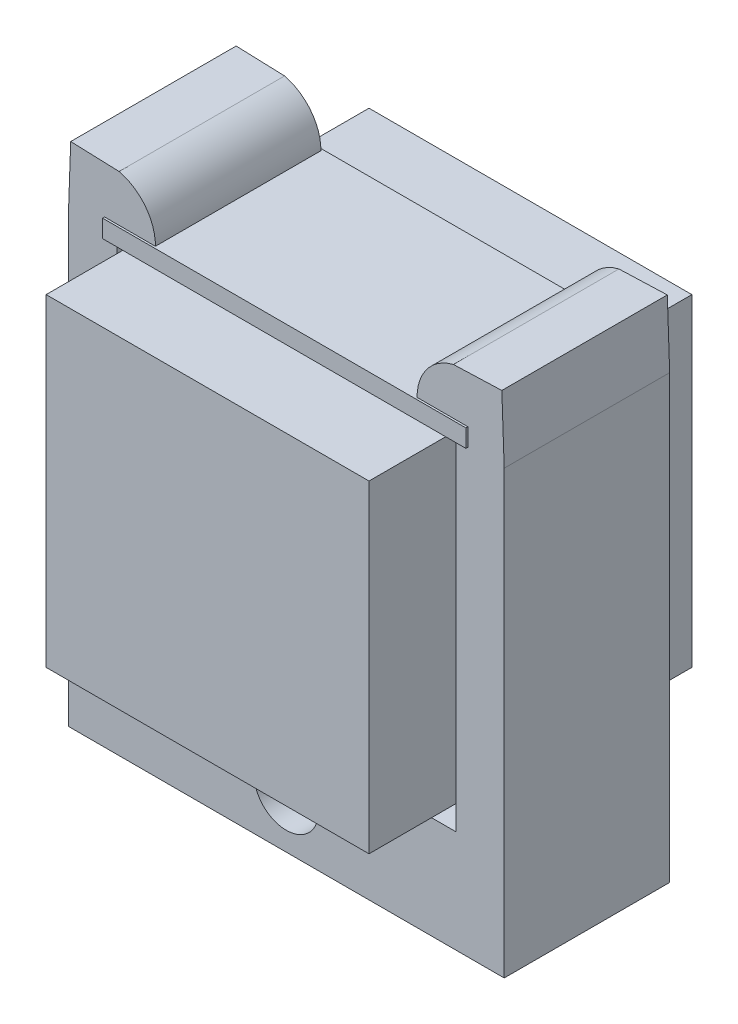
ISO-10303-21;
HEADER;
FILE_DESCRIPTION(('STEP AP214'),'2;1');
FILE_NAME('part.step','',(''),(''),'','','');
FILE_SCHEMA(('AUTOMOTIVE_DESIGN { 1 0 10303 214 1 1 1 1 }'));
ENDSEC;
DATA;
#1=APPLICATION_CONTEXT('core data for automotive mechanical design processes');
#2=APPLICATION_PROTOCOL_DEFINITION('international standard','automotive_design',2000,#1);
#3=PRODUCT_CONTEXT('',#1,'mechanical');
#4=PRODUCT('Part','Part','',(#3));
#5=PRODUCT_RELATED_PRODUCT_CATEGORY('part','',(#4));
#6=PRODUCT_DEFINITION_FORMATION('','',#4);
#7=PRODUCT_DEFINITION_CONTEXT('part definition',#1,'design');
#8=PRODUCT_DEFINITION('design','',#6,#7);
#9=PRODUCT_DEFINITION_SHAPE('','',#8);
#10=(LENGTH_UNIT() NAMED_UNIT(*) SI_UNIT(.MILLI.,.METRE.));
#11=(NAMED_UNIT(*) PLANE_ANGLE_UNIT() SI_UNIT($,.RADIAN.));
#12=(NAMED_UNIT(*) SI_UNIT($,.STERADIAN.) SOLID_ANGLE_UNIT());
#13=UNCERTAINTY_MEASURE_WITH_UNIT(LENGTH_MEASURE(1.E-05),#10,'distance_accuracy_value','');
#14=(GEOMETRIC_REPRESENTATION_CONTEXT(3) GLOBAL_UNCERTAINTY_ASSIGNED_CONTEXT((#13)) GLOBAL_UNIT_ASSIGNED_CONTEXT((#10,
#11,#12)) REPRESENTATION_CONTEXT('',''));
#15=CARTESIAN_POINT('',(0.,0.,0.));
#16=DIRECTION('',(0.,0.,1.));
#17=DIRECTION('',(1.,0.,0.));
#18=AXIS2_PLACEMENT_3D('',#15,#16,#17);
#19=CARTESIAN_POINT('',(-22.1162360565613,2.24126818755349,10.25));
#20=DIRECTION('',(0.,0.,-1.));
#21=DIRECTION('',(-1.,0.,0.));
#22=AXIS2_PLACEMENT_3D('',#19,#20,#21);
#23=CYLINDRICAL_SURFACE('',#22,5.90884853000027);
#24=CARTESIAN_POINT('',(-22.1162360565613,2.24126818755349,-10.25));
#25=DIRECTION('',(0.,0.,1.));
#26=DIRECTION('',(1.,0.,0.));
#27=AXIS2_PLACEMENT_3D('',#24,#25,#26);
#28=CIRCLE('',#27,5.90884853000027);
#29=CARTESIAN_POINT('',(-20.7111523237129,7.98062622257545,-10.25));
#30=VERTEX_POINT('',#29);
#31=CARTESIAN_POINT('',(-16.2111523237129,2.03037233995178,-10.25));
#32=VERTEX_POINT('',#31);
#33=EDGE_CURVE('E199',#30,#32,#28,.F.);
#34=ORIENTED_EDGE('',*,*,#33,.F.);
#35=DIRECTION('',(0.,0.,-1.));
#36=VECTOR('',#35,1.);
#37=CARTESIAN_POINT('',(-20.7111523237129,7.98062622257545,10.25));
#38=LINE('',#37,#36);
#39=CARTESIAN_POINT('',(-20.7111523237129,7.98062622257545,10.25));
#40=VERTEX_POINT('',#39);
#41=EDGE_CURVE('E12',#40,#30,#38,.T.);
#42=ORIENTED_EDGE('',*,*,#41,.F.);
#43=CARTESIAN_POINT('',(-22.1162360565613,2.24126818755349,10.25));
#44=DIRECTION('',(0.,0.,1.));
#45=DIRECTION('',(1.,0.,0.));
#46=AXIS2_PLACEMENT_3D('',#43,#44,#45);
#47=CIRCLE('',#46,5.90884853000027);
#48=CARTESIAN_POINT('',(-16.2111523237129,2.03037233995178,10.25));
#49=VERTEX_POINT('',#48);
#50=EDGE_CURVE('E242',#40,#49,#47,.F.);
#51=ORIENTED_EDGE('',*,*,#50,.T.);
#52=DIRECTION('',(0.,0.,-1.));
#53=VECTOR('',#52,1.);
#54=CARTESIAN_POINT('',(-16.2111523237129,2.03037233995178,10.25));
#55=LINE('',#54,#53);
#56=EDGE_CURVE('E70',#49,#32,#55,.T.);
#57=ORIENTED_EDGE('',*,*,#56,.T.);
#58=EDGE_LOOP('',(#34,#42,#51,#57));
#59=FACE_BOUND('',#58,.T.);
#60=ADVANCED_FACE('F54',(#59),#23,.T.);
#61=CARTESIAN_POINT('',(0.258275645743161,7.23171808080924,10.25));
#62=DIRECTION('',(0.0356915305124089,0.99936285434755,0.));
#63=DIRECTION('',(-0.99936285434755,0.0356915305124089,0.));
#64=AXIS2_PLACEMENT_3D('',#61,#62,#63);
#65=PLANE('',#64);
#66=DIRECTION('',(0.99936285434755,-0.0356915305124089,0.));
#67=VECTOR('',#66,1.);
#68=CARTESIAN_POINT('',(0.258275645743161,7.23171808080924,-10.25));
#69=LINE('',#68,#67);
#70=CARTESIAN_POINT('',(-26.7073294497982,8.19477540564991,-10.25));
#71=VERTEX_POINT('',#70);
#72=EDGE_CURVE('E201',#71,#30,#69,.T.);
#73=ORIENTED_EDGE('',*,*,#72,.F.);
#74=DIRECTION('',(0.,0.,-1.));
#75=VECTOR('',#74,1.);
#76=CARTESIAN_POINT('',(-26.7073294497982,8.19477540564991,10.25));
#77=LINE('',#76,#75);
#78=CARTESIAN_POINT('',(-26.7073294497982,8.19477540564991,10.25));
#79=VERTEX_POINT('',#78);
#80=EDGE_CURVE('E62',#79,#71,#77,.T.);
#81=ORIENTED_EDGE('',*,*,#80,.F.);
#82=DIRECTION('',(0.99936285434755,-0.0356915305124089,0.));
#83=VECTOR('',#82,1.);
#84=CARTESIAN_POINT('',(0.258275645743161,7.23171808080924,10.25));
#85=LINE('',#84,#83);
#86=EDGE_CURVE('E293',#79,#40,#85,.T.);
#87=ORIENTED_EDGE('',*,*,#86,.T.);
#88=ORIENTED_EDGE('',*,*,#41,.T.);
#89=EDGE_LOOP('',(#73,#81,#87,#88));
#90=FACE_BOUND('',#89,.T.);
#91=ADVANCED_FACE('F279',(#90),#65,.T.);
#92=CARTESIAN_POINT('',(-26.9656050955414,0.963057324840671,10.25));
#93=DIRECTION('',(-0.99936285434755,0.035691530512409,0.));
#94=DIRECTION('',(-0.035691530512409,-0.99936285434755,0.));
#95=AXIS2_PLACEMENT_3D('',#92,#93,#94);
#96=PLANE('',#95);
#97=DIRECTION('',(0.035691530512409,0.99936285434755,0.));
#98=VECTOR('',#97,1.);
#99=CARTESIAN_POINT('',(-26.9656050955414,0.963057324840671,-10.25));
#100=LINE('',#99,#98);
#101=CARTESIAN_POINT('',(-27.,0.,-10.25));
#102=VERTEX_POINT('',#101);
#103=EDGE_CURVE('E204',#102,#71,#100,.T.);
#104=ORIENTED_EDGE('',*,*,#103,.F.);
#105=DIRECTION('',(0.,0.,-1.));
#106=VECTOR('',#105,1.);
#107=CARTESIAN_POINT('',(-27.,0.,10.25));
#108=LINE('',#107,#106);
#109=CARTESIAN_POINT('',(-27.,0.,10.25));
#110=VERTEX_POINT('',#109);
#111=EDGE_CURVE('E268',#110,#102,#108,.T.);
#112=ORIENTED_EDGE('',*,*,#111,.F.);
#113=DIRECTION('',(0.035691530512409,0.99936285434755,0.));
#114=VECTOR('',#113,1.);
#115=CARTESIAN_POINT('',(-26.9656050955414,0.963057324840671,10.25));
#116=LINE('',#115,#114);
#117=EDGE_CURVE('E275',#110,#79,#116,.T.);
#118=ORIENTED_EDGE('',*,*,#117,.T.);
#119=ORIENTED_EDGE('',*,*,#80,.T.);
#120=EDGE_LOOP('',(#104,#112,#118,#119));
#121=FACE_BOUND('',#120,.T.);
#122=ADVANCED_FACE('F273',(#121),#96,.T.);
#123=CARTESIAN_POINT('',(-27.,0.,10.25));
#124=DIRECTION('',(-1.,0.,0.));
#125=DIRECTION('',(0.,0.,1.));
#126=AXIS2_PLACEMENT_3D('',#123,#124,#125);
#127=PLANE('',#126);
#128=DIRECTION('',(0.,1.,0.));
#129=VECTOR('',#128,1.);
#130=CARTESIAN_POINT('',(-27.,0.,-10.25));
#131=LINE('',#130,#129);
#132=CARTESIAN_POINT('',(-27.,-54.7,-10.25));
#133=VERTEX_POINT('',#132);
#134=EDGE_CURVE('E207',#133,#102,#131,.T.);
#135=ORIENTED_EDGE('',*,*,#134,.F.);
#136=DIRECTION('',(0.,0.,-1.));
#137=VECTOR('',#136,1.);
#138=CARTESIAN_POINT('',(-27.,-54.7,10.25));
#139=LINE('',#138,#137);
#140=CARTESIAN_POINT('',(-27.,-54.7,10.25));
#141=VERTEX_POINT('',#140);
#142=EDGE_CURVE('E266',#141,#133,#139,.T.);
#143=ORIENTED_EDGE('',*,*,#142,.F.);
#144=DIRECTION('',(0.,1.,0.));
#145=VECTOR('',#144,1.);
#146=CARTESIAN_POINT('',(-27.,0.,10.25));
#147=LINE('',#146,#145);
#148=EDGE_CURVE('E290',#141,#110,#147,.T.);
#149=ORIENTED_EDGE('',*,*,#148,.T.);
#150=ORIENTED_EDGE('',*,*,#111,.T.);
#151=EDGE_LOOP('',(#135,#143,#149,#150));
#152=FACE_BOUND('',#151,.T.);
#153=ADVANCED_FACE('F287',(#152),#127,.T.);
#154=CARTESIAN_POINT('',(0.,-54.7,10.25));
#155=DIRECTION('',(0.,-1.,0.));
#156=DIRECTION('',(0.,0.,-1.));
#157=AXIS2_PLACEMENT_3D('',#154,#155,#156);
#158=PLANE('',#157);
#159=DIRECTION('',(-1.,0.,0.));
#160=VECTOR('',#159,1.);
#161=CARTESIAN_POINT('',(0.,-54.7,-10.25));
#162=LINE('',#161,#160);
#163=CARTESIAN_POINT('',(27.,-54.7,-10.25));
#164=VERTEX_POINT('',#163);
#165=EDGE_CURVE('E210',#164,#133,#162,.T.);
#166=ORIENTED_EDGE('',*,*,#165,.F.);
#167=DIRECTION('',(0.,0.,-1.));
#168=VECTOR('',#167,1.);
#169=CARTESIAN_POINT('',(27.,-54.7,10.25));
#170=LINE('',#169,#168);
#171=CARTESIAN_POINT('',(27.,-54.7,10.25));
#172=VERTEX_POINT('',#171);
#173=EDGE_CURVE('E264',#172,#164,#170,.T.);
#174=ORIENTED_EDGE('',*,*,#173,.F.);
#175=DIRECTION('',(-1.,0.,0.));
#176=VECTOR('',#175,1.);
#177=CARTESIAN_POINT('',(0.,-54.7,10.25));
#178=LINE('',#177,#176);
#179=EDGE_CURVE('E295',#172,#141,#178,.T.);
#180=ORIENTED_EDGE('',*,*,#179,.T.);
#181=ORIENTED_EDGE('',*,*,#142,.T.);
#182=EDGE_LOOP('',(#166,#174,#180,#181));
#183=FACE_BOUND('',#182,.T.);
#184=ADVANCED_FACE('F342',(#183),#158,.T.);
#185=CARTESIAN_POINT('',(27.,0.,10.25));
#186=DIRECTION('',(-1.,0.,0.));
#187=DIRECTION('',(0.,0.,1.));
#188=AXIS2_PLACEMENT_3D('',#185,#186,#187);
#189=PLANE('',#188);
#190=DIRECTION('',(0.,1.,0.));
#191=VECTOR('',#190,1.);
#192=CARTESIAN_POINT('',(27.,0.,-10.25));
#193=LINE('',#192,#191);
#194=CARTESIAN_POINT('',(27.,0.,-10.25));
#195=VERTEX_POINT('',#194);
#196=EDGE_CURVE('E213',#164,#195,#193,.T.);
#197=ORIENTED_EDGE('',*,*,#196,.T.);
#198=DIRECTION('',(0.,0.,-1.));
#199=VECTOR('',#198,1.);
#200=CARTESIAN_POINT('',(27.,0.,10.25));
#201=LINE('',#200,#199);
#202=CARTESIAN_POINT('',(27.,0.,10.25));
#203=VERTEX_POINT('',#202);
#204=EDGE_CURVE('E261',#203,#195,#201,.T.);
#205=ORIENTED_EDGE('',*,*,#204,.F.);
#206=DIRECTION('',(0.,1.,0.));
#207=VECTOR('',#206,1.);
#208=CARTESIAN_POINT('',(27.,0.,10.25));
#209=LINE('',#208,#207);
#210=EDGE_CURVE('E301',#172,#203,#209,.T.);
#211=ORIENTED_EDGE('',*,*,#210,.F.);
#212=ORIENTED_EDGE('',*,*,#173,.T.);
#213=EDGE_LOOP('',(#197,#205,#211,#212));
#214=FACE_BOUND('',#213,.T.);
#215=ADVANCED_FACE('F345',(#214),#189,.F.);
#216=CARTESIAN_POINT('',(26.9656050955414,0.963057324840671,10.25));
#217=DIRECTION('',(-0.99936285434755,-0.035691530512409,0.));
#218=DIRECTION('',(0.035691530512409,-0.99936285434755,0.));
#219=AXIS2_PLACEMENT_3D('',#216,#217,#218);
#220=PLANE('',#219);
#221=DIRECTION('',(-0.035691530512409,0.99936285434755,0.));
#222=VECTOR('',#221,1.);
#223=CARTESIAN_POINT('',(26.9656050955414,0.963057324840671,-10.25));
#224=LINE('',#223,#222);
#225=CARTESIAN_POINT('',(26.7073294497982,8.19477540564991,-10.25));
#226=VERTEX_POINT('',#225);
#227=EDGE_CURVE('E215',#195,#226,#224,.T.);
#228=ORIENTED_EDGE('',*,*,#227,.T.);
#229=DIRECTION('',(0.,0.,-1.));
#230=VECTOR('',#229,1.);
#231=CARTESIAN_POINT('',(26.7073294497982,8.19477540564991,10.25));
#232=LINE('',#231,#230);
#233=CARTESIAN_POINT('',(26.7073294497982,8.19477540564991,10.25));
#234=VERTEX_POINT('',#233);
#235=EDGE_CURVE('E258',#234,#226,#232,.T.);
#236=ORIENTED_EDGE('',*,*,#235,.F.);
#237=DIRECTION('',(-0.035691530512409,0.99936285434755,0.));
#238=VECTOR('',#237,1.);
#239=CARTESIAN_POINT('',(26.9656050955414,0.963057324840671,10.25));
#240=LINE('',#239,#238);
#241=EDGE_CURVE('E303',#203,#234,#240,.T.);
#242=ORIENTED_EDGE('',*,*,#241,.F.);
#243=ORIENTED_EDGE('',*,*,#204,.T.);
#244=EDGE_LOOP('',(#228,#236,#242,#243));
#245=FACE_BOUND('',#244,.T.);
#246=ADVANCED_FACE('F349',(#245),#220,.F.);
#247=CARTESIAN_POINT('',(-0.258275645743161,7.23171808080924,10.25));
#248=DIRECTION('',(0.0356915305124089,-0.99936285434755,0.));
#249=DIRECTION('',(0.99936285434755,0.0356915305124089,0.));
#250=AXIS2_PLACEMENT_3D('',#247,#248,#249);
#251=PLANE('',#250);
#252=DIRECTION('',(-0.99936285434755,-0.0356915305124089,0.));
#253=VECTOR('',#252,1.);
#254=CARTESIAN_POINT('',(-0.258275645743161,7.23171808080924,-10.25));
#255=LINE('',#254,#253);
#256=CARTESIAN_POINT('',(20.7111523237129,7.98062622257545,-10.25));
#257=VERTEX_POINT('',#256);
#258=EDGE_CURVE('E217',#226,#257,#255,.T.);
#259=ORIENTED_EDGE('',*,*,#258,.T.);
#260=DIRECTION('',(0.,0.,-1.));
#261=VECTOR('',#260,1.);
#262=CARTESIAN_POINT('',(20.7111523237129,7.98062622257545,10.25));
#263=LINE('',#262,#261);
#264=CARTESIAN_POINT('',(20.7111523237129,7.98062622257545,10.25));
#265=VERTEX_POINT('',#264);
#266=EDGE_CURVE('E255',#265,#257,#263,.T.);
#267=ORIENTED_EDGE('',*,*,#266,.F.);
#268=DIRECTION('',(-0.99936285434755,-0.0356915305124089,0.));
#269=VECTOR('',#268,1.);
#270=CARTESIAN_POINT('',(-0.258275645743161,7.23171808080924,10.25));
#271=LINE('',#270,#269);
#272=EDGE_CURVE('E305',#234,#265,#271,.T.);
#273=ORIENTED_EDGE('',*,*,#272,.F.);
#274=ORIENTED_EDGE('',*,*,#235,.T.);
#275=EDGE_LOOP('',(#259,#267,#273,#274));
#276=FACE_BOUND('',#275,.T.);
#277=ADVANCED_FACE('F353',(#276),#251,.F.);
#278=CARTESIAN_POINT('',(22.1162360565613,2.24126818755349,10.25));
#279=DIRECTION('',(0.,0.,-1.));
#280=DIRECTION('',(-1.,0.,0.));
#281=AXIS2_PLACEMENT_3D('',#278,#279,#280);
#282=CYLINDRICAL_SURFACE('',#281,5.90884853000027);
#283=CARTESIAN_POINT('',(22.1162360565613,2.24126818755349,-10.25));
#284=DIRECTION('',(0.,0.,1.));
#285=DIRECTION('',(1.,0.,0.));
#286=AXIS2_PLACEMENT_3D('',#283,#284,#285);
#287=CIRCLE('',#286,5.90884853000027);
#288=CARTESIAN_POINT('',(16.2111523237129,2.03037233995178,-10.25));
#289=VERTEX_POINT('',#288);
#290=EDGE_CURVE('E219',#257,#289,#287,.T.);
#291=ORIENTED_EDGE('',*,*,#290,.T.);
#292=DIRECTION('',(0.,0.,-1.));
#293=VECTOR('',#292,1.);
#294=CARTESIAN_POINT('',(16.2111523237129,2.03037233995178,10.25));
#295=LINE('',#294,#293);
#296=CARTESIAN_POINT('',(16.2111523237129,2.03037233995178,10.25));
#297=VERTEX_POINT('',#296);
#298=EDGE_CURVE('E252',#297,#289,#295,.T.);
#299=ORIENTED_EDGE('',*,*,#298,.F.);
#300=CARTESIAN_POINT('',(22.1162360565613,2.24126818755349,10.25));
#301=DIRECTION('',(0.,0.,1.));
#302=DIRECTION('',(1.,0.,0.));
#303=AXIS2_PLACEMENT_3D('',#300,#301,#302);
#304=CIRCLE('',#303,5.90884853000027);
#305=EDGE_CURVE('E307',#265,#297,#304,.T.);
#306=ORIENTED_EDGE('',*,*,#305,.F.);
#307=ORIENTED_EDGE('',*,*,#266,.T.);
#308=EDGE_LOOP('',(#291,#299,#306,#307));
#309=FACE_BOUND('',#308,.T.);
#310=ADVANCED_FACE('F357',(#309),#282,.T.);
#311=CARTESIAN_POINT('',(-0.0517697747706173,1.44955369357742,10.25));
#312=DIRECTION('',(-0.0356915305124093,0.99936285434755,0.));
#313=DIRECTION('',(-0.99936285434755,-0.0356915305124093,0.));
#314=AXIS2_PLACEMENT_3D('',#311,#312,#313);
#315=PLANE('',#314);
#316=DIRECTION('',(0.99936285434755,0.0356915305124093,0.));
#317=VECTOR('',#316,1.);
#318=CARTESIAN_POINT('',(-0.0517697747706173,1.44955369357742,-10.25));
#319=LINE('',#318,#317);
#320=CARTESIAN_POINT('',(20.9214786328727,2.19859827956461,-10.25));
#321=VERTEX_POINT('',#320);
#322=EDGE_CURVE('E221',#289,#321,#319,.T.);
#323=ORIENTED_EDGE('',*,*,#322,.T.);
#324=DIRECTION('',(0.,0.,-1.));
#325=VECTOR('',#324,1.);
#326=CARTESIAN_POINT('',(20.9214786328727,2.19859827956461,10.25));
#327=LINE('',#326,#325);
#328=CARTESIAN_POINT('',(20.9214786328727,2.19859827956461,10.25));
#329=VERTEX_POINT('',#328);
#330=EDGE_CURVE('E250',#329,#321,#327,.T.);
#331=ORIENTED_EDGE('',*,*,#330,.F.);
#332=DIRECTION('',(0.99936285434755,0.0356915305124093,0.));
#333=VECTOR('',#332,1.);
#334=CARTESIAN_POINT('',(-0.0517697747706173,1.44955369357742,10.25));
#335=LINE('',#334,#333);
#336=EDGE_CURVE('E309',#297,#329,#335,.T.);
#337=ORIENTED_EDGE('',*,*,#336,.F.);
#338=ORIENTED_EDGE('',*,*,#298,.T.);
#339=EDGE_LOOP('',(#323,#331,#337,#338));
#340=FACE_BOUND('',#339,.T.);
#341=ADVANCED_FACE('F361',(#340),#315,.F.);
#342=CARTESIAN_POINT('',(20.9732484076433,0.749044585987179,10.25));
#343=DIRECTION('',(-0.99936285434755,-0.0356915305124086,0.));
#344=DIRECTION('',(0.0356915305124086,-0.99936285434755,0.));
#345=AXIS2_PLACEMENT_3D('',#342,#343,#344);
#346=PLANE('',#345);
#347=DIRECTION('',(-0.0356915305124086,0.99936285434755,0.));
#348=VECTOR('',#347,1.);
#349=CARTESIAN_POINT('',(20.9732484076433,0.749044585987179,-10.25));
#350=LINE('',#349,#348);
#351=CARTESIAN_POINT('',(21.,0.,-10.25));
#352=VERTEX_POINT('',#351);
#353=EDGE_CURVE('E224',#352,#321,#350,.T.);
#354=ORIENTED_EDGE('',*,*,#353,.F.);
#355=DIRECTION('',(0.,0.,-1.));
#356=VECTOR('',#355,1.);
#357=CARTESIAN_POINT('',(21.,0.,10.25));
#358=LINE('',#357,#356);
#359=CARTESIAN_POINT('',(21.,0.,10.25));
#360=VERTEX_POINT('',#359);
#361=EDGE_CURVE('E248',#360,#352,#358,.T.);
#362=ORIENTED_EDGE('',*,*,#361,.F.);
#363=DIRECTION('',(-0.0356915305124086,0.99936285434755,0.));
#364=VECTOR('',#363,1.);
#365=CARTESIAN_POINT('',(20.9732484076433,0.749044585987179,10.25));
#366=LINE('',#365,#364);
#367=EDGE_CURVE('E311',#360,#329,#366,.T.);
#368=ORIENTED_EDGE('',*,*,#367,.T.);
#369=ORIENTED_EDGE('',*,*,#330,.T.);
#370=EDGE_LOOP('',(#354,#362,#368,#369));
#371=FACE_BOUND('',#370,.T.);
#372=ADVANCED_FACE('F365',(#371),#346,.T.);
#373=CARTESIAN_POINT('',(21.,0.,10.25));
#374=DIRECTION('',(-1.,0.,0.));
#375=DIRECTION('',(0.,0.,1.));
#376=AXIS2_PLACEMENT_3D('',#373,#374,#375);
#377=PLANE('',#376);
#378=DIRECTION('',(0.,1.,0.));
#379=VECTOR('',#378,1.);
#380=CARTESIAN_POINT('',(21.,0.,-10.25));
#381=LINE('',#380,#379);
#382=CARTESIAN_POINT('',(21.,-42.,-10.25));
#383=VERTEX_POINT('',#382);
#384=EDGE_CURVE('E227',#383,#352,#381,.T.);
#385=ORIENTED_EDGE('',*,*,#384,.F.);
#386=DIRECTION('',(0.,0.,-1.));
#387=VECTOR('',#386,1.);
#388=CARTESIAN_POINT('',(21.,-42.,10.25));
#389=LINE('',#388,#387);
#390=CARTESIAN_POINT('',(21.,-42.,10.25));
#391=VERTEX_POINT('',#390);
#392=EDGE_CURVE('E246',#391,#383,#389,.T.);
#393=ORIENTED_EDGE('',*,*,#392,.F.);
#394=DIRECTION('',(0.,1.,0.));
#395=VECTOR('',#394,1.);
#396=CARTESIAN_POINT('',(21.,0.,10.25));
#397=LINE('',#396,#395);
#398=EDGE_CURVE('E314',#391,#360,#397,.T.);
#399=ORIENTED_EDGE('',*,*,#398,.T.);
#400=ORIENTED_EDGE('',*,*,#361,.T.);
#401=EDGE_LOOP('',(#385,#393,#399,#400));
#402=FACE_BOUND('',#401,.T.);
#403=ADVANCED_FACE('F369',(#402),#377,.T.);
#404=CARTESIAN_POINT('',(0.,-42.,10.25));
#405=DIRECTION('',(0.,1.,0.));
#406=DIRECTION('',(0.,0.,1.));
#407=AXIS2_PLACEMENT_3D('',#404,#405,#406);
#408=PLANE('',#407);
#409=DIRECTION('',(1.,0.,0.));
#410=VECTOR('',#409,1.);
#411=CARTESIAN_POINT('',(0.,-42.,-10.25));
#412=LINE('',#411,#410);
#413=CARTESIAN_POINT('',(-21.,-42.,-10.25));
#414=VERTEX_POINT('',#413);
#415=EDGE_CURVE('E230',#414,#383,#412,.T.);
#416=ORIENTED_EDGE('',*,*,#415,.F.);
#417=DIRECTION('',(0.,0.,-1.));
#418=VECTOR('',#417,1.);
#419=CARTESIAN_POINT('',(-21.,-42.,10.25));
#420=LINE('',#419,#418);
#421=CARTESIAN_POINT('',(-21.,-42.,10.25));
#422=VERTEX_POINT('',#421);
#423=EDGE_CURVE('E188',#422,#414,#420,.T.);
#424=ORIENTED_EDGE('',*,*,#423,.F.);
#425=DIRECTION('',(1.,0.,0.));
#426=VECTOR('',#425,1.);
#427=CARTESIAN_POINT('',(0.,-42.,10.25));
#428=LINE('',#427,#426);
#429=EDGE_CURVE('E178',#422,#391,#428,.T.);
#430=ORIENTED_EDGE('',*,*,#429,.T.);
#431=ORIENTED_EDGE('',*,*,#392,.T.);
#432=EDGE_LOOP('',(#416,#424,#430,#431));
#433=FACE_BOUND('',#432,.T.);
#434=ADVANCED_FACE('F318',(#433),#408,.T.);
#435=CARTESIAN_POINT('',(-21.,0.,10.25));
#436=DIRECTION('',(-1.,0.,0.));
#437=DIRECTION('',(0.,0.,1.));
#438=AXIS2_PLACEMENT_3D('',#435,#436,#437);
#439=PLANE('',#438);
#440=DIRECTION('',(0.,1.,0.));
#441=VECTOR('',#440,1.);
#442=CARTESIAN_POINT('',(-21.,0.,-10.25));
#443=LINE('',#442,#441);
#444=CARTESIAN_POINT('',(-21.,0.,-10.25));
#445=VERTEX_POINT('',#444);
#446=EDGE_CURVE('E185',#414,#445,#443,.T.);
#447=ORIENTED_EDGE('',*,*,#446,.T.);
#448=DIRECTION('',(0.,0.,-1.));
#449=VECTOR('',#448,1.);
#450=CARTESIAN_POINT('',(-21.,0.,10.25));
#451=LINE('',#450,#449);
#452=CARTESIAN_POINT('',(-21.,0.,10.25));
#453=VERTEX_POINT('',#452);
#454=EDGE_CURVE('E182',#453,#445,#451,.T.);
#455=ORIENTED_EDGE('',*,*,#454,.F.);
#456=DIRECTION('',(0.,1.,0.));
#457=VECTOR('',#456,1.);
#458=CARTESIAN_POINT('',(-21.,0.,10.25));
#459=LINE('',#458,#457);
#460=EDGE_CURVE('E169',#422,#453,#459,.T.);
#461=ORIENTED_EDGE('',*,*,#460,.F.);
#462=ORIENTED_EDGE('',*,*,#423,.T.);
#463=EDGE_LOOP('',(#447,#455,#461,#462));
#464=FACE_BOUND('',#463,.T.);
#465=ADVANCED_FACE('F183',(#464),#439,.F.);
#466=CARTESIAN_POINT('',(-20.9732484076433,0.749044585987146,10.25));
#467=DIRECTION('',(-0.99936285434755,0.035691530512407,0.));
#468=DIRECTION('',(-0.035691530512407,-0.99936285434755,0.));
#469=AXIS2_PLACEMENT_3D('',#466,#467,#468);
#470=PLANE('',#469);
#471=DIRECTION('',(0.035691530512407,0.99936285434755,0.));
#472=VECTOR('',#471,1.);
#473=CARTESIAN_POINT('',(-20.9732484076433,0.749044585987146,-10.25));
#474=LINE('',#473,#472);
#475=CARTESIAN_POINT('',(-20.9214786328727,2.19859827956461,-10.25));
#476=VERTEX_POINT('',#475);
#477=EDGE_CURVE('E234',#445,#476,#474,.T.);
#478=ORIENTED_EDGE('',*,*,#477,.T.);
#479=DIRECTION('',(0.,0.,-1.));
#480=VECTOR('',#479,1.);
#481=CARTESIAN_POINT('',(-20.9214786328727,2.19859827956461,10.25));
#482=LINE('',#481,#480);
#483=CARTESIAN_POINT('',(-20.9214786328727,2.19859827956461,10.25));
#484=VERTEX_POINT('',#483);
#485=EDGE_CURVE('E120',#484,#476,#482,.T.);
#486=ORIENTED_EDGE('',*,*,#485,.F.);
#487=DIRECTION('',(0.035691530512407,0.99936285434755,0.));
#488=VECTOR('',#487,1.);
#489=CARTESIAN_POINT('',(-20.9732484076433,0.749044585987146,10.25));
#490=LINE('',#489,#488);
#491=EDGE_CURVE('E175',#453,#484,#490,.T.);
#492=ORIENTED_EDGE('',*,*,#491,.F.);
#493=ORIENTED_EDGE('',*,*,#454,.T.);
#494=EDGE_LOOP('',(#478,#486,#492,#493));
#495=FACE_BOUND('',#494,.T.);
#496=ADVANCED_FACE('F190',(#495),#470,.F.);
#497=CARTESIAN_POINT('',(0.0517697747706173,1.44955369357742,10.25));
#498=DIRECTION('',(-0.0356915305124092,-0.99936285434755,0.));
#499=DIRECTION('',(0.99936285434755,-0.0356915305124092,0.));
#500=AXIS2_PLACEMENT_3D('',#497,#498,#499);
#501=PLANE('',#500);
#502=DIRECTION('',(-0.99936285434755,0.0356915305124092,0.));
#503=VECTOR('',#502,1.);
#504=CARTESIAN_POINT('',(0.0517697747706173,1.44955369357742,-10.25));
#505=LINE('',#504,#503);
#506=EDGE_CURVE('E236',#32,#476,#505,.T.);
#507=ORIENTED_EDGE('',*,*,#506,.F.);
#508=ORIENTED_EDGE('',*,*,#56,.F.);
#509=DIRECTION('',(-0.99936285434755,0.0356915305124092,0.));
#510=VECTOR('',#509,1.);
#511=CARTESIAN_POINT('',(0.0517697747706173,1.44955369357742,10.25));
#512=LINE('',#511,#510);
#513=EDGE_CURVE('E191',#49,#484,#512,.T.);
#514=ORIENTED_EDGE('',*,*,#513,.T.);
#515=ORIENTED_EDGE('',*,*,#485,.T.);
#516=EDGE_LOOP('',(#507,#508,#514,#515));
#517=FACE_BOUND('',#516,.T.);
#518=ADVANCED_FACE('F320',(#517),#501,.T.);
#519=CARTESIAN_POINT('',(0.,-48.35,10.25));
#520=DIRECTION('',(0.,0.,-1.));
#521=DIRECTION('',(-1.,0.,0.));
#522=AXIS2_PLACEMENT_3D('',#519,#520,#521);
#523=CYLINDRICAL_SURFACE('',#522,4.);
#524=CARTESIAN_POINT('',(0.,-48.35,10.25));
#525=DIRECTION('',(0.,0.,1.));
#526=DIRECTION('',(1.,0.,0.));
#527=AXIS2_PLACEMENT_3D('',#524,#525,#526);
#528=CIRCLE('',#527,4.);
#529=CARTESIAN_POINT('',(4.,-48.35,10.25));
#530=VERTEX_POINT('',#529);
#531=EDGE_CURVE('E193',#530,#530,#528,.T.);
#532=ORIENTED_EDGE('',*,*,#531,.T.);
#533=EDGE_LOOP('',(#532));
#534=FACE_BOUND('',#533,.T.);
#535=CARTESIAN_POINT('',(0.,-48.35,-10.25));
#536=DIRECTION('',(0.,0.,1.));
#537=DIRECTION('',(1.,0.,0.));
#538=AXIS2_PLACEMENT_3D('',#535,#536,#537);
#539=CIRCLE('',#538,4.);
#540=CARTESIAN_POINT('',(4.,-48.35,-10.25));
#541=VERTEX_POINT('',#540);
#542=EDGE_CURVE('E239',#541,#541,#539,.T.);
#543=ORIENTED_EDGE('',*,*,#542,.F.);
#544=EDGE_LOOP('',(#543));
#545=FACE_BOUND('',#544,.T.);
#546=ADVANCED_FACE('F322',(#534,#545),#523,.F.);
#547=CARTESIAN_POINT('',(0.,0.,10.25));
#548=DIRECTION('',(0.,0.,1.));
#549=DIRECTION('',(1.,0.,0.));
#550=AXIS2_PLACEMENT_3D('',#547,#548,#549);
#551=PLANE('',#550);
#552=ORIENTED_EDGE('',*,*,#50,.F.);
#553=ORIENTED_EDGE('',*,*,#86,.F.);
#554=ORIENTED_EDGE('',*,*,#117,.F.);
#555=ORIENTED_EDGE('',*,*,#148,.F.);
#556=ORIENTED_EDGE('',*,*,#179,.F.);
#557=ORIENTED_EDGE('',*,*,#210,.T.);
#558=ORIENTED_EDGE('',*,*,#241,.T.);
#559=ORIENTED_EDGE('',*,*,#272,.T.);
#560=ORIENTED_EDGE('',*,*,#305,.T.);
#561=ORIENTED_EDGE('',*,*,#336,.T.);
#562=ORIENTED_EDGE('',*,*,#367,.F.);
#563=ORIENTED_EDGE('',*,*,#398,.F.);
#564=ORIENTED_EDGE('',*,*,#429,.F.);
#565=ORIENTED_EDGE('',*,*,#460,.T.);
#566=ORIENTED_EDGE('',*,*,#491,.T.);
#567=ORIENTED_EDGE('',*,*,#513,.F.);
#568=EDGE_LOOP('',(#552,#553,#554,#555,#556,#557,#558,#559,#560,#561,#562,#563,#564,#565,#566,#567));
#569=FACE_BOUND('',#568,.T.);
#570=ORIENTED_EDGE('',*,*,#531,.F.);
#571=EDGE_LOOP('',(#570));
#572=FACE_BOUND('',#571,.T.);
#573=ADVANCED_FACE('F171',(#569,#572),#551,.T.);
#574=CARTESIAN_POINT('',(0.,0.,-10.25));
#575=DIRECTION('',(0.,0.,1.));
#576=DIRECTION('',(1.,0.,0.));
#577=AXIS2_PLACEMENT_3D('',#574,#575,#576);
#578=PLANE('',#577);
#579=ORIENTED_EDGE('',*,*,#33,.T.);
#580=ORIENTED_EDGE('',*,*,#506,.T.);
#581=ORIENTED_EDGE('',*,*,#477,.F.);
#582=ORIENTED_EDGE('',*,*,#446,.F.);
#583=ORIENTED_EDGE('',*,*,#415,.T.);
#584=ORIENTED_EDGE('',*,*,#384,.T.);
#585=ORIENTED_EDGE('',*,*,#353,.T.);
#586=ORIENTED_EDGE('',*,*,#322,.F.);
#587=ORIENTED_EDGE('',*,*,#290,.F.);
#588=ORIENTED_EDGE('',*,*,#258,.F.);
#589=ORIENTED_EDGE('',*,*,#227,.F.);
#590=ORIENTED_EDGE('',*,*,#196,.F.);
#591=ORIENTED_EDGE('',*,*,#165,.T.);
#592=ORIENTED_EDGE('',*,*,#134,.T.);
#593=ORIENTED_EDGE('',*,*,#103,.T.);
#594=ORIENTED_EDGE('',*,*,#72,.T.);
#595=EDGE_LOOP('',(#579,#580,#581,#582,#583,#584,#585,#586,#587,#588,#589,#590,#591,#592,#593,#594));
#596=FACE_BOUND('',#595,.T.);
#597=ORIENTED_EDGE('',*,*,#542,.T.);
#598=EDGE_LOOP('',(#597));
#599=FACE_BOUND('',#598,.T.);
#600=ADVANCED_FACE('F281',(#596,#599),#578,.F.);
#601=CLOSED_SHELL('',(#60,#91,#122,#153,#184,#215,#246,#277,#310,#341,#372,#403,#434,#465,#496,
#518,#546,#573,#600));
#602=MANIFOLD_SOLID_BREP('B2',#601);
#603=CARTESIAN_POINT('',(20.,-40.,20.));
#604=DIRECTION('',(1.,0.,0.));
#605=DIRECTION('',(0.,0.,-1.));
#606=AXIS2_PLACEMENT_3D('',#603,#604,#605);
#607=PLANE('',#606);
#608=DIRECTION('',(0.,0.,-1.));
#609=VECTOR('',#608,1.);
#610=CARTESIAN_POINT('',(20.,0.,20.));
#611=LINE('',#610,#609);
#612=CARTESIAN_POINT('',(20.,0.,20.));
#613=VERTEX_POINT('',#612);
#614=CARTESIAN_POINT('',(20.,0.,-20.));
#615=VERTEX_POINT('',#614);
#616=EDGE_CURVE('E646',#613,#615,#611,.T.);
#617=ORIENTED_EDGE('',*,*,#616,.F.);
#618=DIRECTION('',(0.,1.,0.));
#619=VECTOR('',#618,1.);
#620=CARTESIAN_POINT('',(20.,-40.,20.));
#621=LINE('',#620,#619);
#622=CARTESIAN_POINT('',(20.,-40.,20.));
#623=VERTEX_POINT('',#622);
#624=EDGE_CURVE('E52',#623,#613,#621,.T.);
#625=ORIENTED_EDGE('',*,*,#624,.F.);
#626=DIRECTION('',(0.,0.,-1.));
#627=VECTOR('',#626,1.);
#628=CARTESIAN_POINT('',(20.,-40.,20.));
#629=LINE('',#628,#627);
#630=CARTESIAN_POINT('',(20.,-40.,-20.));
#631=VERTEX_POINT('',#630);
#632=EDGE_CURVE('E640',#623,#631,#629,.T.);
#633=ORIENTED_EDGE('',*,*,#632,.T.);
#634=DIRECTION('',(0.,1.,0.));
#635=VECTOR('',#634,1.);
#636=CARTESIAN_POINT('',(20.,-40.,-20.));
#637=LINE('',#636,#635);
#638=EDGE_CURVE('E585',#631,#615,#637,.T.);
#639=ORIENTED_EDGE('',*,*,#638,.T.);
#640=EDGE_LOOP('',(#617,#625,#633,#639));
#641=FACE_BOUND('',#640,.T.);
#642=ADVANCED_FACE('F582',(#641),#607,.T.);
#643=CARTESIAN_POINT('',(-20.,-40.,20.));
#644=DIRECTION('',(0.,0.,1.));
#645=DIRECTION('',(1.,0.,0.));
#646=AXIS2_PLACEMENT_3D('',#643,#644,#645);
#647=PLANE('',#646);
#648=DIRECTION('',(1.,0.,0.));
#649=VECTOR('',#648,1.);
#650=CARTESIAN_POINT('',(-20.,0.,20.));
#651=LINE('',#650,#649);
#652=CARTESIAN_POINT('',(-20.,0.,20.));
#653=VERTEX_POINT('',#652);
#654=EDGE_CURVE('E642',#653,#613,#651,.T.);
#655=ORIENTED_EDGE('',*,*,#654,.F.);
#656=DIRECTION('',(0.,1.,0.));
#657=VECTOR('',#656,1.);
#658=CARTESIAN_POINT('',(-20.,-40.,20.));
#659=LINE('',#658,#657);
#660=CARTESIAN_POINT('',(-20.,-40.,20.));
#661=VERTEX_POINT('',#660);
#662=EDGE_CURVE('E591',#661,#653,#659,.T.);
#663=ORIENTED_EDGE('',*,*,#662,.F.);
#664=DIRECTION('',(1.,0.,0.));
#665=VECTOR('',#664,1.);
#666=CARTESIAN_POINT('',(-20.,-40.,20.));
#667=LINE('',#666,#665);
#668=EDGE_CURVE('E637',#661,#623,#667,.T.);
#669=ORIENTED_EDGE('',*,*,#668,.T.);
#670=ORIENTED_EDGE('',*,*,#624,.T.);
#671=EDGE_LOOP('',(#655,#663,#669,#670));
#672=FACE_BOUND('',#671,.T.);
#673=ADVANCED_FACE('F656',(#672),#647,.T.);
#674=CARTESIAN_POINT('',(-20.,-40.,20.));
#675=DIRECTION('',(-1.,0.,0.));
#676=DIRECTION('',(0.,0.,1.));
#677=AXIS2_PLACEMENT_3D('',#674,#675,#676);
#678=PLANE('',#677);
#679=DIRECTION('',(0.,0.,1.));
#680=VECTOR('',#679,1.);
#681=CARTESIAN_POINT('',(-20.,0.,20.));
#682=LINE('',#681,#680);
#683=CARTESIAN_POINT('',(-20.,0.,-20.));
#684=VERTEX_POINT('',#683);
#685=EDGE_CURVE('E632',#684,#653,#682,.T.);
#686=ORIENTED_EDGE('',*,*,#685,.F.);
#687=DIRECTION('',(0.,1.,0.));
#688=VECTOR('',#687,1.);
#689=CARTESIAN_POINT('',(-20.,-40.,-20.));
#690=LINE('',#689,#688);
#691=CARTESIAN_POINT('',(-20.,-40.,-20.));
#692=VERTEX_POINT('',#691);
#693=EDGE_CURVE('E627',#692,#684,#690,.T.);
#694=ORIENTED_EDGE('',*,*,#693,.F.);
#695=DIRECTION('',(0.,0.,1.));
#696=VECTOR('',#695,1.);
#697=CARTESIAN_POINT('',(-20.,-40.,20.));
#698=LINE('',#697,#696);
#699=EDGE_CURVE('E630',#692,#661,#698,.T.);
#700=ORIENTED_EDGE('',*,*,#699,.T.);
#701=ORIENTED_EDGE('',*,*,#662,.T.);
#702=EDGE_LOOP('',(#686,#694,#700,#701));
#703=FACE_BOUND('',#702,.T.);
#704=ADVANCED_FACE('F629',(#703),#678,.T.);
#705=CARTESIAN_POINT('',(-20.,-40.,-20.));
#706=DIRECTION('',(0.,0.,-1.));
#707=DIRECTION('',(-1.,0.,0.));
#708=AXIS2_PLACEMENT_3D('',#705,#706,#707);
#709=PLANE('',#708);
#710=DIRECTION('',(-1.,0.,0.));
#711=VECTOR('',#710,1.);
#712=CARTESIAN_POINT('',(-20.,0.,-20.));
#713=LINE('',#712,#711);
#714=EDGE_CURVE('E649',#615,#684,#713,.T.);
#715=ORIENTED_EDGE('',*,*,#714,.F.);
#716=ORIENTED_EDGE('',*,*,#638,.F.);
#717=DIRECTION('',(-1.,0.,0.));
#718=VECTOR('',#717,1.);
#719=CARTESIAN_POINT('',(-20.,-40.,-20.));
#720=LINE('',#719,#718);
#721=EDGE_CURVE('E636',#631,#692,#720,.T.);
#722=ORIENTED_EDGE('',*,*,#721,.T.);
#723=ORIENTED_EDGE('',*,*,#693,.T.);
#724=EDGE_LOOP('',(#715,#716,#722,#723));
#725=FACE_BOUND('',#724,.T.);
#726=ADVANCED_FACE('F639',(#725),#709,.T.);
#727=CARTESIAN_POINT('',(0.,-40.,0.));
#728=DIRECTION('',(0.,-1.,0.));
#729=DIRECTION('',(0.,0.,-1.));
#730=AXIS2_PLACEMENT_3D('',#727,#728,#729);
#731=PLANE('',#730);
#732=ORIENTED_EDGE('',*,*,#632,.F.);
#733=ORIENTED_EDGE('',*,*,#668,.F.);
#734=ORIENTED_EDGE('',*,*,#699,.F.);
#735=ORIENTED_EDGE('',*,*,#721,.F.);
#736=EDGE_LOOP('',(#732,#733,#734,#735));
#737=FACE_BOUND('',#736,.T.);
#738=ADVANCED_FACE('F635',(#737),#731,.T.);
#739=CARTESIAN_POINT('',(0.,0.,0.));
#740=DIRECTION('',(0.,-1.,0.));
#741=DIRECTION('',(0.,0.,-1.));
#742=AXIS2_PLACEMENT_3D('',#739,#740,#741);
#743=PLANE('',#742);
#744=ORIENTED_EDGE('',*,*,#616,.T.);
#745=ORIENTED_EDGE('',*,*,#714,.T.);
#746=ORIENTED_EDGE('',*,*,#685,.T.);
#747=ORIENTED_EDGE('',*,*,#654,.T.);
#748=EDGE_LOOP('',(#744,#745,#746,#747));
#749=FACE_BOUND('',#748,.T.);
#750=ADVANCED_FACE('F655',(#749),#743,.F.);
#751=CLOSED_SHELL('',(#642,#673,#704,#726,#738,#750));
#752=MANIFOLD_SOLID_BREP('B6',#751);
#753=CARTESIAN_POINT('',(22.5,2.2,10.5));
#754=DIRECTION('',(-1.,0.,0.));
#755=DIRECTION('',(0.,0.,1.));
#756=AXIS2_PLACEMENT_3D('',#753,#754,#755);
#757=PLANE('',#756);
#758=DIRECTION('',(0.,0.,-1.));
#759=VECTOR('',#758,1.);
#760=CARTESIAN_POINT('',(22.5,0.,10.5));
#761=LINE('',#760,#759);
#762=CARTESIAN_POINT('',(22.5,0.,10.5));
#763=VERTEX_POINT('',#762);
#764=CARTESIAN_POINT('',(22.5,0.,-10.5));
#765=VERTEX_POINT('',#764);
#766=EDGE_CURVE('E781',#763,#765,#761,.T.);
#767=ORIENTED_EDGE('',*,*,#766,.T.);
#768=DIRECTION('',(0.,-1.,0.));
#769=VECTOR('',#768,1.);
#770=CARTESIAN_POINT('',(22.5,2.2,-10.5));
#771=LINE('',#770,#769);
#772=CARTESIAN_POINT('',(22.5,2.2,-10.5));
#773=VERTEX_POINT('',#772);
#774=EDGE_CURVE('E580',#773,#765,#771,.T.);
#775=ORIENTED_EDGE('',*,*,#774,.F.);
#776=DIRECTION('',(0.,0.,-1.));
#777=VECTOR('',#776,1.);
#778=CARTESIAN_POINT('',(22.5,2.2,10.5));
#779=LINE('',#778,#777);
#780=CARTESIAN_POINT('',(22.5,2.2,10.5));
#781=VERTEX_POINT('',#780);
#782=EDGE_CURVE('E769',#781,#773,#779,.T.);
#783=ORIENTED_EDGE('',*,*,#782,.F.);
#784=DIRECTION('',(0.,-1.,0.));
#785=VECTOR('',#784,1.);
#786=CARTESIAN_POINT('',(22.5,2.2,10.5));
#787=LINE('',#786,#785);
#788=EDGE_CURVE('E777',#781,#763,#787,.T.);
#789=ORIENTED_EDGE('',*,*,#788,.T.);
#790=EDGE_LOOP('',(#767,#775,#783,#789));
#791=FACE_BOUND('',#790,.T.);
#792=ADVANCED_FACE('F718',(#791),#757,.F.);
#793=CARTESIAN_POINT('',(-22.5,2.2,-10.5));
#794=DIRECTION('',(0.,0.,1.));
#795=DIRECTION('',(1.,0.,0.));
#796=AXIS2_PLACEMENT_3D('',#793,#794,#795);
#797=PLANE('',#796);
#798=DIRECTION('',(-1.,0.,0.));
#799=VECTOR('',#798,1.);
#800=CARTESIAN_POINT('',(-22.5,0.,-10.5));
#801=LINE('',#800,#799);
#802=CARTESIAN_POINT('',(-22.5,0.,-10.5));
#803=VERTEX_POINT('',#802);
#804=EDGE_CURVE('E773',#765,#803,#801,.T.);
#805=ORIENTED_EDGE('',*,*,#804,.T.);
#806=DIRECTION('',(0.,-1.,0.));
#807=VECTOR('',#806,1.);
#808=CARTESIAN_POINT('',(-22.5,2.2,-10.5));
#809=LINE('',#808,#807);
#810=CARTESIAN_POINT('',(-22.5,2.2,-10.5));
#811=VERTEX_POINT('',#810);
#812=EDGE_CURVE('E726',#811,#803,#809,.T.);
#813=ORIENTED_EDGE('',*,*,#812,.F.);
#814=DIRECTION('',(-1.,0.,0.));
#815=VECTOR('',#814,1.);
#816=CARTESIAN_POINT('',(-22.5,2.2,-10.5));
#817=LINE('',#816,#815);
#818=EDGE_CURVE('E764',#773,#811,#817,.T.);
#819=ORIENTED_EDGE('',*,*,#818,.F.);
#820=ORIENTED_EDGE('',*,*,#774,.T.);
#821=EDGE_LOOP('',(#805,#813,#819,#820));
#822=FACE_BOUND('',#821,.T.);
#823=ADVANCED_FACE('F772',(#822),#797,.F.);
#824=CARTESIAN_POINT('',(-22.5,2.2,10.5));
#825=DIRECTION('',(1.,0.,0.));
#826=DIRECTION('',(0.,0.,-1.));
#827=AXIS2_PLACEMENT_3D('',#824,#825,#826);
#828=PLANE('',#827);
#829=DIRECTION('',(0.,0.,1.));
#830=VECTOR('',#829,1.);
#831=CARTESIAN_POINT('',(-22.5,0.,10.5));
#832=LINE('',#831,#830);
#833=CARTESIAN_POINT('',(-22.5,0.,10.5));
#834=VERTEX_POINT('',#833);
#835=EDGE_CURVE('E751',#803,#834,#832,.T.);
#836=ORIENTED_EDGE('',*,*,#835,.T.);
#837=DIRECTION('',(0.,-1.,0.));
#838=VECTOR('',#837,1.);
#839=CARTESIAN_POINT('',(-22.5,2.2,10.5));
#840=LINE('',#839,#838);
#841=CARTESIAN_POINT('',(-22.5,2.2,10.5));
#842=VERTEX_POINT('',#841);
#843=EDGE_CURVE('E774',#842,#834,#840,.T.);
#844=ORIENTED_EDGE('',*,*,#843,.F.);
#845=DIRECTION('',(0.,0.,1.));
#846=VECTOR('',#845,1.);
#847=CARTESIAN_POINT('',(-22.5,2.2,10.5));
#848=LINE('',#847,#846);
#849=EDGE_CURVE('E767',#811,#842,#848,.T.);
#850=ORIENTED_EDGE('',*,*,#849,.F.);
#851=ORIENTED_EDGE('',*,*,#812,.T.);
#852=EDGE_LOOP('',(#836,#844,#850,#851));
#853=FACE_BOUND('',#852,.T.);
#854=ADVANCED_FACE('F775',(#853),#828,.F.);
#855=CARTESIAN_POINT('',(-22.5,2.2,10.5));
#856=DIRECTION('',(0.,0.,-1.));
#857=DIRECTION('',(-1.,0.,0.));
#858=AXIS2_PLACEMENT_3D('',#855,#856,#857);
#859=PLANE('',#858);
#860=DIRECTION('',(1.,0.,0.));
#861=VECTOR('',#860,1.);
#862=CARTESIAN_POINT('',(-22.5,0.,10.5));
#863=LINE('',#862,#861);
#864=EDGE_CURVE('E757',#834,#763,#863,.T.);
#865=ORIENTED_EDGE('',*,*,#864,.T.);
#866=ORIENTED_EDGE('',*,*,#788,.F.);
#867=DIRECTION('',(1.,0.,0.));
#868=VECTOR('',#867,1.);
#869=CARTESIAN_POINT('',(-22.5,2.2,10.5));
#870=LINE('',#869,#868);
#871=EDGE_CURVE('E734',#842,#781,#870,.T.);
#872=ORIENTED_EDGE('',*,*,#871,.F.);
#873=ORIENTED_EDGE('',*,*,#843,.T.);
#874=EDGE_LOOP('',(#865,#866,#872,#873));
#875=FACE_BOUND('',#874,.T.);
#876=ADVANCED_FACE('F788',(#875),#859,.F.);
#877=CARTESIAN_POINT('',(0.,2.2,0.));
#878=DIRECTION('',(0.,-1.,0.));
#879=DIRECTION('',(0.,0.,-1.));
#880=AXIS2_PLACEMENT_3D('',#877,#878,#879);
#881=PLANE('',#880);
#882=ORIENTED_EDGE('',*,*,#782,.T.);
#883=ORIENTED_EDGE('',*,*,#818,.T.);
#884=ORIENTED_EDGE('',*,*,#849,.T.);
#885=ORIENTED_EDGE('',*,*,#871,.T.);
#886=EDGE_LOOP('',(#882,#883,#884,#885));
#887=FACE_BOUND('',#886,.T.);
#888=ADVANCED_FACE('F765',(#887),#881,.F.);
#889=CARTESIAN_POINT('',(0.,0.,0.));
#890=DIRECTION('',(0.,-1.,0.));
#891=DIRECTION('',(0.,0.,-1.));
#892=AXIS2_PLACEMENT_3D('',#889,#890,#891);
#893=PLANE('',#892);
#894=ORIENTED_EDGE('',*,*,#766,.F.);
#895=ORIENTED_EDGE('',*,*,#864,.F.);
#896=ORIENTED_EDGE('',*,*,#835,.F.);
#897=ORIENTED_EDGE('',*,*,#804,.F.);
#898=EDGE_LOOP('',(#894,#895,#896,#897));
#899=FACE_BOUND('',#898,.T.);
#900=ADVANCED_FACE('F791',(#899),#893,.T.);
#901=CLOSED_SHELL('',(#792,#823,#854,#876,#888,#900));
#902=MANIFOLD_SOLID_BREP('B46',#901);
#903=ADVANCED_BREP_SHAPE_REPRESENTATION('',(#18,#602,#752,#902),#14);
#904=SHAPE_DEFINITION_REPRESENTATION(#9,#903);
ENDSEC;
END-ISO-10303-21;
